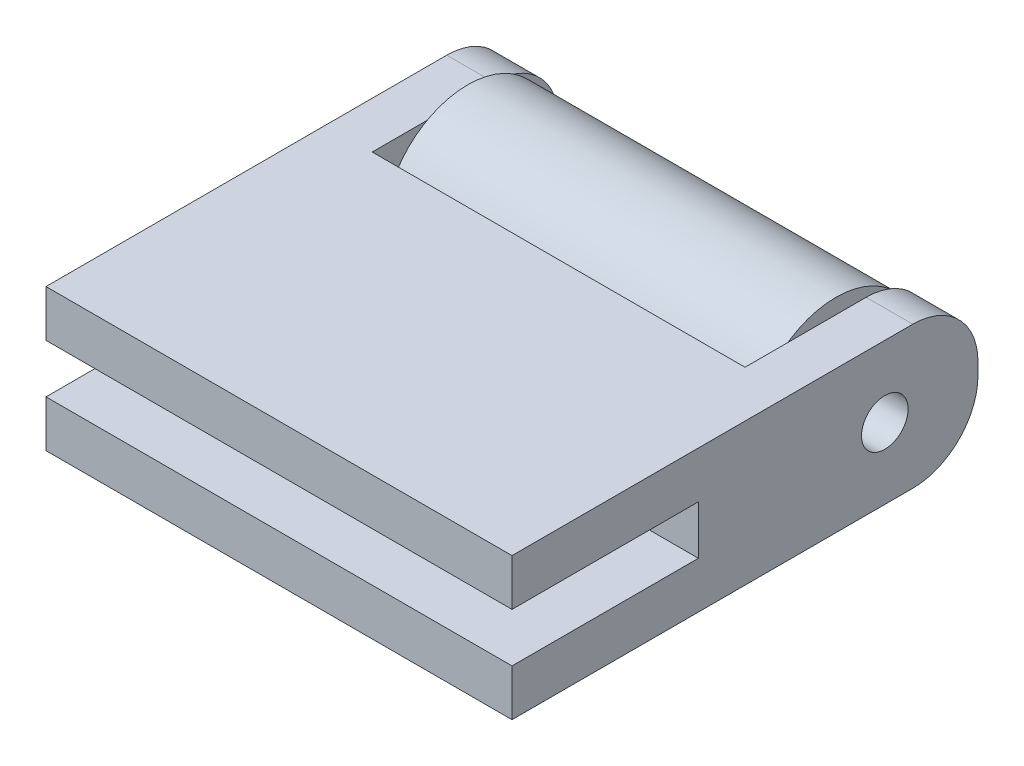
ISO-10303-21;
HEADER;
FILE_DESCRIPTION(('STEP AP214'),'2;1');
FILE_NAME('part.step','',(''),(''),'','','');
FILE_SCHEMA(('AUTOMOTIVE_DESIGN { 1 0 10303 214 1 1 1 1 }'));
ENDSEC;
DATA;
#1=APPLICATION_CONTEXT('core data for automotive mechanical design processes');
#2=APPLICATION_PROTOCOL_DEFINITION('international standard','automotive_design',2000,#1);
#3=PRODUCT_CONTEXT('',#1,'mechanical');
#4=PRODUCT('Part','Part','',(#3));
#5=PRODUCT_RELATED_PRODUCT_CATEGORY('part','',(#4));
#6=PRODUCT_DEFINITION_FORMATION('','',#4);
#7=PRODUCT_DEFINITION_CONTEXT('part definition',#1,'design');
#8=PRODUCT_DEFINITION('design','',#6,#7);
#9=PRODUCT_DEFINITION_SHAPE('','',#8);
#10=(LENGTH_UNIT() NAMED_UNIT(*) SI_UNIT(.MILLI.,.METRE.));
#11=(NAMED_UNIT(*) PLANE_ANGLE_UNIT() SI_UNIT($,.RADIAN.));
#12=(NAMED_UNIT(*) SI_UNIT($,.STERADIAN.) SOLID_ANGLE_UNIT());
#13=UNCERTAINTY_MEASURE_WITH_UNIT(LENGTH_MEASURE(1.E-05),#10,'distance_accuracy_value','');
#14=(GEOMETRIC_REPRESENTATION_CONTEXT(3) GLOBAL_UNCERTAINTY_ASSIGNED_CONTEXT((#13)) GLOBAL_UNIT_ASSIGNED_CONTEXT((#10,
#11,#12)) REPRESENTATION_CONTEXT('',''));
#15=CARTESIAN_POINT('',(0.,0.,0.));
#16=DIRECTION('',(0.,0.,1.));
#17=DIRECTION('',(1.,0.,0.));
#18=AXIS2_PLACEMENT_3D('',#15,#16,#17);
#19=CARTESIAN_POINT('',(44.75,7.625,-40.));
#20=DIRECTION('',(-1.,0.,0.));
#21=DIRECTION('',(0.,0.,1.));
#22=AXIS2_PLACEMENT_3D('',#19,#20,#21);
#23=CYLINDRICAL_SURFACE('',#22,9.);
#24=CARTESIAN_POINT('',(44.75,7.625,-40.));
#25=DIRECTION('',(1.,0.,0.));
#26=DIRECTION('',(0.,0.,-1.));
#27=AXIS2_PLACEMENT_3D('',#24,#25,#26);
#28=CIRCLE('',#27,9.);
#29=CARTESIAN_POINT('',(44.75,7.625,-49.));
#30=VERTEX_POINT('',#29);
#31=EDGE_CURVE('E11',#30,#30,#28,.T.);
#32=ORIENTED_EDGE('',*,*,#31,.F.);
#33=EDGE_LOOP('',(#32));
#34=FACE_BOUND('',#33,.T.);
#35=CARTESIAN_POINT('',(5.25,7.625,-40.));
#36=DIRECTION('',(1.,0.,0.));
#37=DIRECTION('',(0.,0.,-1.));
#38=AXIS2_PLACEMENT_3D('',#35,#36,#37);
#39=CIRCLE('',#38,9.);
#40=CARTESIAN_POINT('',(5.25,7.625,-49.));
#41=VERTEX_POINT('',#40);
#42=EDGE_CURVE('E59',#41,#41,#39,.T.);
#43=ORIENTED_EDGE('',*,*,#42,.T.);
#44=EDGE_LOOP('',(#43));
#45=FACE_BOUND('',#44,.T.);
#46=ADVANCED_FACE('F56',(#34,#45),#23,.T.);
#47=CARTESIAN_POINT('',(44.75,7.625,-40.));
#48=DIRECTION('',(1.,0.,0.));
#49=DIRECTION('',(0.,0.,-1.));
#50=AXIS2_PLACEMENT_3D('',#47,#48,#49);
#51=PLANE('',#50);
#52=CARTESIAN_POINT('',(44.75,7.625,-40.));
#53=DIRECTION('',(1.,0.,0.));
#54=DIRECTION('',(0.,0.,-1.));
#55=AXIS2_PLACEMENT_3D('',#52,#53,#54);
#56=CIRCLE('',#55,2.375);
#57=CARTESIAN_POINT('',(44.75,7.625,-37.625));
#58=VERTEX_POINT('',#57);
#59=EDGE_CURVE('E66',#58,#58,#56,.T.);
#60=ORIENTED_EDGE('',*,*,#59,.F.);
#61=EDGE_LOOP('',(#60));
#62=FACE_BOUND('',#61,.T.);
#63=ORIENTED_EDGE('',*,*,#31,.T.);
#64=EDGE_LOOP('',(#63));
#65=FACE_BOUND('',#64,.T.);
#66=ADVANCED_FACE('F79',(#62,#65),#51,.T.);
#67=CARTESIAN_POINT('',(5.25,7.625,-40.));
#68=DIRECTION('',(1.,0.,0.));
#69=DIRECTION('',(0.,0.,-1.));
#70=AXIS2_PLACEMENT_3D('',#67,#68,#69);
#71=PLANE('',#70);
#72=CARTESIAN_POINT('',(5.25,7.625,-40.));
#73=DIRECTION('',(-1.,0.,0.));
#74=DIRECTION('',(0.,0.,1.));
#75=AXIS2_PLACEMENT_3D('',#72,#73,#74);
#76=CIRCLE('',#75,2.375);
#77=CARTESIAN_POINT('',(5.25,7.625,-37.625));
#78=VERTEX_POINT('',#77);
#79=EDGE_CURVE('E70',#78,#78,#76,.T.);
#80=ORIENTED_EDGE('',*,*,#79,.F.);
#81=EDGE_LOOP('',(#80));
#82=FACE_BOUND('',#81,.T.);
#83=ORIENTED_EDGE('',*,*,#42,.F.);
#84=EDGE_LOOP('',(#83));
#85=FACE_BOUND('',#84,.T.);
#86=ADVANCED_FACE('F76',(#82,#85),#71,.F.);
#87=CARTESIAN_POINT('',(50.,7.625,-40.));
#88=DIRECTION('',(-1.,0.,0.));
#89=DIRECTION('',(0.,0.,1.));
#90=AXIS2_PLACEMENT_3D('',#87,#88,#89);
#91=CYLINDRICAL_SURFACE('',#90,2.375);
#92=CARTESIAN_POINT('',(44.75,7.625,-37.625));
#93=CARTESIAN_POINT('',(44.3385416666667,7.625,-37.625));
#94=CARTESIAN_POINT('',(43.9270833333333,7.625,-37.625));
#95=CARTESIAN_POINT('',(43.1041666666667,7.625,-37.625));
#96=CARTESIAN_POINT('',(42.6927083333333,7.625,-37.625));
#97=CARTESIAN_POINT('',(41.8697916666667,7.625,-37.625));
#98=CARTESIAN_POINT('',(41.4583333333333,7.625,-37.625));
#99=CARTESIAN_POINT('',(40.6354166666667,7.625,-37.625));
#100=CARTESIAN_POINT('',(40.2239583333333,7.625,-37.625));
#101=CARTESIAN_POINT('',(39.4010416666667,7.625,-37.625));
#102=CARTESIAN_POINT('',(38.9895833333333,7.625,-37.625));
#103=CARTESIAN_POINT('',(38.1666666666667,7.625,-37.625));
#104=CARTESIAN_POINT('',(37.7552083333333,7.625,-37.625));
#105=CARTESIAN_POINT('',(36.9322916666667,7.625,-37.625));
#106=CARTESIAN_POINT('',(36.5208333333333,7.625,-37.625));
#107=CARTESIAN_POINT('',(35.6979166666667,7.625,-37.625));
#108=CARTESIAN_POINT('',(35.2864583333333,7.625,-37.625));
#109=CARTESIAN_POINT('',(34.4635416666667,7.625,-37.625));
#110=CARTESIAN_POINT('',(34.0520833333333,7.625,-37.625));
#111=CARTESIAN_POINT('',(33.2291666666667,7.625,-37.625));
#112=CARTESIAN_POINT('',(32.8177083333333,7.625,-37.625));
#113=CARTESIAN_POINT('',(31.9947916666667,7.625,-37.625));
#114=CARTESIAN_POINT('',(31.5833333333333,7.625,-37.625));
#115=CARTESIAN_POINT('',(30.7604166666667,7.625,-37.625));
#116=CARTESIAN_POINT('',(30.3489583333333,7.625,-37.625));
#117=CARTESIAN_POINT('',(29.5260416666667,7.625,-37.625));
#118=CARTESIAN_POINT('',(29.1145833333333,7.625,-37.625));
#119=CARTESIAN_POINT('',(28.2916666666667,7.625,-37.625));
#120=CARTESIAN_POINT('',(27.8802083333333,7.625,-37.625));
#121=CARTESIAN_POINT('',(27.0572916666667,7.625,-37.625));
#122=CARTESIAN_POINT('',(26.6458333333333,7.625,-37.625));
#123=CARTESIAN_POINT('',(25.8229166666667,7.625,-37.625));
#124=CARTESIAN_POINT('',(25.4114583333333,7.625,-37.625));
#125=CARTESIAN_POINT('',(24.5885416666667,7.625,-37.625));
#126=CARTESIAN_POINT('',(24.1770833333333,7.625,-37.625));
#127=CARTESIAN_POINT('',(23.3541666666667,7.625,-37.625));
#128=CARTESIAN_POINT('',(22.9427083333333,7.625,-37.625));
#129=CARTESIAN_POINT('',(22.1197916666667,7.625,-37.625));
#130=CARTESIAN_POINT('',(21.7083333333333,7.625,-37.625));
#131=CARTESIAN_POINT('',(20.8854166666667,7.625,-37.625));
#132=CARTESIAN_POINT('',(20.4739583333333,7.625,-37.625));
#133=CARTESIAN_POINT('',(19.6510416666667,7.625,-37.625));
#134=CARTESIAN_POINT('',(19.2395833333333,7.625,-37.625));
#135=CARTESIAN_POINT('',(18.4166666666667,7.625,-37.625));
#136=CARTESIAN_POINT('',(18.0052083333333,7.625,-37.625));
#137=CARTESIAN_POINT('',(17.1822916666667,7.625,-37.625));
#138=CARTESIAN_POINT('',(16.7708333333333,7.625,-37.625));
#139=CARTESIAN_POINT('',(15.9479166666667,7.625,-37.625));
#140=CARTESIAN_POINT('',(15.5364583333333,7.625,-37.625));
#141=CARTESIAN_POINT('',(14.7135416666667,7.625,-37.625));
#142=CARTESIAN_POINT('',(14.3020833333333,7.625,-37.625));
#143=CARTESIAN_POINT('',(13.4791666666667,7.625,-37.625));
#144=CARTESIAN_POINT('',(13.0677083333333,7.625,-37.625));
#145=CARTESIAN_POINT('',(12.2447916666667,7.625,-37.625));
#146=CARTESIAN_POINT('',(11.8333333333333,7.625,-37.625));
#147=CARTESIAN_POINT('',(11.0104166666667,7.625,-37.625));
#148=CARTESIAN_POINT('',(10.5989583333333,7.625,-37.625));
#149=CARTESIAN_POINT('',(9.77604166666667,7.625,-37.625));
#150=CARTESIAN_POINT('',(9.36458333333334,7.625,-37.625));
#151=CARTESIAN_POINT('',(8.54166666666667,7.625,-37.625));
#152=CARTESIAN_POINT('',(8.13020833333333,7.625,-37.625));
#153=CARTESIAN_POINT('',(7.30729166666666,7.625,-37.625));
#154=CARTESIAN_POINT('',(6.89583333333333,7.625,-37.625));
#155=CARTESIAN_POINT('',(6.07291666666667,7.625,-37.625));
#156=CARTESIAN_POINT('',(5.66145833333334,7.625,-37.625));
#157=CARTESIAN_POINT('',(5.25,7.625,-37.625));
#158=B_SPLINE_CURVE_WITH_KNOTS('',3,(#92,#93,#94,#95,#96,#97,#98,#99,#100,#101,#102,#103,#104,
#105,#106,#107,#108,#109,#110,#111,#112,#113,#114,#115,#116,#117,#118,#119,#120,#121,#122,#123,
#124,#125,#126,#127,#128,#129,#130,#131,#132,#133,#134,#135,#136,#137,#138,#139,#140,#141,#142,
#143,#144,#145,#146,#147,#148,#149,#150,#151,#152,#153,#154,#155,#156,#157),.UNSPECIFIED.,.F.,
.F.,(4,2,2,2,2,2,2,2,2,2,2,2,2,2,2,2,2,2,2,2,2,2,2,2,2,2,2,2,2,2,2,2,4),(0.,1.234375,
2.46875000000001,3.703125,4.9375,6.171875,7.40625,8.64062500000001,9.875,11.109375,12.34375,
13.578125,14.8125,16.046875,17.28125,18.515625,19.75,20.984375,22.21875,23.453125,24.6875,
25.921875,27.15625,28.390625,29.625,30.859375,32.09375,33.328125,34.5625,35.796875,37.03125,
38.265625,39.5),.UNSPECIFIED.);
#159=EDGE_CURVE('BSEAM74',#58,#78,#158,.T.);
#160=ORIENTED_EDGE('',*,*,#59,.T.);
#161=ORIENTED_EDGE('',*,*,#79,.T.);
#162=ORIENTED_EDGE('',*,*,#159,.T.);
#163=ORIENTED_EDGE('',*,*,#159,.F.);
#164=EDGE_LOOP('',(#160,#162,#161,#163));
#165=FACE_BOUND('',#164,.T.);
#166=ADVANCED_FACE('F74',(#165),#91,.F.);
#167=CLOSED_SHELL('',(#46,#66,#86,#166));
#168=MANIFOLD_SOLID_BREP('B2',#167);
#169=CARTESIAN_POINT('',(50.,0.,-50.));
#170=DIRECTION('',(0.,0.,1.));
#171=DIRECTION('',(1.,0.,0.));
#172=AXIS2_PLACEMENT_3D('',#169,#170,#171);
#173=PLANE('',#172);
#174=DIRECTION('',(0.,1.,0.));
#175=VECTOR('',#174,1.);
#176=CARTESIAN_POINT('',(5.,0.,-50.));
#177=LINE('',#176,#175);
#178=CARTESIAN_POINT('',(5.,7.,-50.));
#179=VERTEX_POINT('',#178);
#180=CARTESIAN_POINT('',(5.,8.25,-50.));
#181=VERTEX_POINT('',#180);
#182=EDGE_CURVE('E271',#179,#181,#177,.T.);
#183=ORIENTED_EDGE('',*,*,#182,.F.);
#184=DIRECTION('',(-1.,0.,0.));
#185=VECTOR('',#184,1.);
#186=CARTESIAN_POINT('',(50.,7.,-50.));
#187=LINE('',#186,#185);
#188=CARTESIAN_POINT('',(0.,7.,-50.));
#189=VERTEX_POINT('',#188);
#190=EDGE_CURVE('E398',#179,#189,#187,.T.);
#191=ORIENTED_EDGE('',*,*,#190,.T.);
#192=DIRECTION('',(0.,1.,0.));
#193=VECTOR('',#192,1.);
#194=CARTESIAN_POINT('',(0.,0.,-50.));
#195=LINE('',#194,#193);
#196=CARTESIAN_POINT('',(0.,8.25,-50.));
#197=VERTEX_POINT('',#196);
#198=EDGE_CURVE('E338',#189,#197,#195,.T.);
#199=ORIENTED_EDGE('',*,*,#198,.T.);
#200=DIRECTION('',(-1.,0.,0.));
#201=VECTOR('',#200,1.);
#202=CARTESIAN_POINT('',(5.,8.25,-50.));
#203=LINE('',#202,#201);
#204=EDGE_CURVE('E395',#197,#181,#203,.F.);
#205=ORIENTED_EDGE('',*,*,#204,.T.);
#206=EDGE_LOOP('',(#183,#191,#199,#205));
#207=FACE_BOUND('',#206,.T.);
#208=ADVANCED_FACE('F117',(#207),#173,.F.);
#209=CARTESIAN_POINT('',(50.,7.625,-40.));
#210=DIRECTION('',(-1.,0.,0.));
#211=DIRECTION('',(0.,0.,1.));
#212=AXIS2_PLACEMENT_3D('',#209,#210,#211);
#213=CYLINDRICAL_SURFACE('',#212,2.5);
#214=CARTESIAN_POINT('',(5.,7.625,-40.));
#215=DIRECTION('',(-1.,0.,0.));
#216=DIRECTION('',(0.,0.,1.));
#217=AXIS2_PLACEMENT_3D('',#214,#215,#216);
#218=CIRCLE('',#217,2.5);
#219=CARTESIAN_POINT('',(5.,7.625,-37.5));
#220=VERTEX_POINT('',#219);
#221=EDGE_CURVE('E319',#220,#220,#218,.T.);
#222=ORIENTED_EDGE('',*,*,#221,.F.);
#223=EDGE_LOOP('',(#222));
#224=FACE_BOUND('',#223,.T.);
#225=CARTESIAN_POINT('',(0.,7.625,-40.));
#226=DIRECTION('',(1.,0.,0.));
#227=DIRECTION('',(0.,0.,-1.));
#228=AXIS2_PLACEMENT_3D('',#225,#226,#227);
#229=CIRCLE('',#228,2.5);
#230=CARTESIAN_POINT('',(0.,7.625,-42.5));
#231=VERTEX_POINT('',#230);
#232=EDGE_CURVE('E314',#231,#231,#229,.T.);
#233=ORIENTED_EDGE('',*,*,#232,.F.);
#234=EDGE_LOOP('',(#233));
#235=FACE_BOUND('',#234,.T.);
#236=ADVANCED_FACE('F475',(#224,#235),#213,.F.);
#237=CARTESIAN_POINT('',(50.,10.25,0.));
#238=DIRECTION('',(0.,1.,0.));
#239=DIRECTION('',(0.,0.,1.));
#240=AXIS2_PLACEMENT_3D('',#237,#238,#239);
#241=PLANE('',#240);
#242=DIRECTION('',(0.,0.,-1.));
#243=VECTOR('',#242,1.);
#244=CARTESIAN_POINT('',(0.,10.25,0.));
#245=LINE('',#244,#243);
#246=CARTESIAN_POINT('',(0.,10.25,0.));
#247=VERTEX_POINT('',#246);
#248=CARTESIAN_POINT('',(0.,10.25,-20.));
#249=VERTEX_POINT('',#248);
#250=EDGE_CURVE('E318',#247,#249,#245,.T.);
#251=ORIENTED_EDGE('',*,*,#250,.T.);
#252=DIRECTION('',(-1.,0.,0.));
#253=VECTOR('',#252,1.);
#254=CARTESIAN_POINT('',(50.,10.25,-20.));
#255=LINE('',#254,#253);
#256=CARTESIAN_POINT('',(50.,10.25,-20.));
#257=VERTEX_POINT('',#256);
#258=EDGE_CURVE('E361',#257,#249,#255,.T.);
#259=ORIENTED_EDGE('',*,*,#258,.F.);
#260=DIRECTION('',(0.,0.,-1.));
#261=VECTOR('',#260,1.);
#262=CARTESIAN_POINT('',(50.,10.25,0.));
#263=LINE('',#262,#261);
#264=CARTESIAN_POINT('',(50.,10.25,0.));
#265=VERTEX_POINT('',#264);
#266=EDGE_CURVE('E285',#265,#257,#263,.T.);
#267=ORIENTED_EDGE('',*,*,#266,.F.);
#268=DIRECTION('',(-1.,0.,0.));
#269=VECTOR('',#268,1.);
#270=CARTESIAN_POINT('',(50.,10.25,0.));
#271=LINE('',#270,#269);
#272=EDGE_CURVE('E346',#265,#247,#271,.T.);
#273=ORIENTED_EDGE('',*,*,#272,.T.);
#274=EDGE_LOOP('',(#251,#259,#267,#273));
#275=FACE_BOUND('',#274,.T.);
#276=ADVANCED_FACE('F448',(#275),#241,.F.);
#277=CARTESIAN_POINT('',(50.,0.,-20.));
#278=DIRECTION('',(0.,0.,-1.));
#279=DIRECTION('',(-1.,0.,0.));
#280=AXIS2_PLACEMENT_3D('',#277,#278,#279);
#281=PLANE('',#280);
#282=DIRECTION('',(0.,-1.,0.));
#283=VECTOR('',#282,1.);
#284=CARTESIAN_POINT('',(0.,0.,-20.));
#285=LINE('',#284,#283);
#286=CARTESIAN_POINT('',(0.,5.,-20.));
#287=VERTEX_POINT('',#286);
#288=EDGE_CURVE('E323',#249,#287,#285,.T.);
#289=ORIENTED_EDGE('',*,*,#288,.T.);
#290=DIRECTION('',(-1.,0.,0.));
#291=VECTOR('',#290,1.);
#292=CARTESIAN_POINT('',(50.,5.,-20.));
#293=LINE('',#292,#291);
#294=CARTESIAN_POINT('',(50.,5.,-20.));
#295=VERTEX_POINT('',#294);
#296=EDGE_CURVE('E358',#295,#287,#293,.T.);
#297=ORIENTED_EDGE('',*,*,#296,.F.);
#298=DIRECTION('',(0.,-1.,0.));
#299=VECTOR('',#298,1.);
#300=CARTESIAN_POINT('',(50.,0.,-20.));
#301=LINE('',#300,#299);
#302=EDGE_CURVE('E290',#257,#295,#301,.T.);
#303=ORIENTED_EDGE('',*,*,#302,.F.);
#304=ORIENTED_EDGE('',*,*,#258,.T.);
#305=EDGE_LOOP('',(#289,#297,#303,#304));
#306=FACE_BOUND('',#305,.T.);
#307=ADVANCED_FACE('F453',(#306),#281,.F.);
#308=CARTESIAN_POINT('',(50.,5.,0.));
#309=DIRECTION('',(0.,1.,0.));
#310=DIRECTION('',(0.,0.,1.));
#311=AXIS2_PLACEMENT_3D('',#308,#309,#310);
#312=PLANE('',#311);
#313=DIRECTION('',(0.,0.,-1.));
#314=VECTOR('',#313,1.);
#315=CARTESIAN_POINT('',(0.,5.,0.));
#316=LINE('',#315,#314);
#317=CARTESIAN_POINT('',(0.,5.,0.));
#318=VERTEX_POINT('',#317);
#319=EDGE_CURVE('E327',#318,#287,#316,.T.);
#320=ORIENTED_EDGE('',*,*,#319,.F.);
#321=DIRECTION('',(-1.,0.,0.));
#322=VECTOR('',#321,1.);
#323=CARTESIAN_POINT('',(50.,5.,0.));
#324=LINE('',#323,#322);
#325=CARTESIAN_POINT('',(50.,5.,0.));
#326=VERTEX_POINT('',#325);
#327=EDGE_CURVE('E355',#326,#318,#324,.T.);
#328=ORIENTED_EDGE('',*,*,#327,.F.);
#329=DIRECTION('',(0.,0.,-1.));
#330=VECTOR('',#329,1.);
#331=CARTESIAN_POINT('',(50.,5.,0.));
#332=LINE('',#331,#330);
#333=EDGE_CURVE('E293',#326,#295,#332,.T.);
#334=ORIENTED_EDGE('',*,*,#333,.T.);
#335=ORIENTED_EDGE('',*,*,#296,.T.);
#336=EDGE_LOOP('',(#320,#328,#334,#335));
#337=FACE_BOUND('',#336,.T.);
#338=ADVANCED_FACE('F456',(#337),#312,.T.);
#339=CARTESIAN_POINT('',(50.,0.,0.));
#340=DIRECTION('',(0.,0.,1.));
#341=DIRECTION('',(1.,0.,0.));
#342=AXIS2_PLACEMENT_3D('',#339,#340,#341);
#343=PLANE('',#342);
#344=DIRECTION('',(0.,1.,0.));
#345=VECTOR('',#344,1.);
#346=CARTESIAN_POINT('',(0.,0.,0.));
#347=LINE('',#346,#345);
#348=CARTESIAN_POINT('',(0.,0.,0.));
#349=VERTEX_POINT('',#348);
#350=EDGE_CURVE('E331',#349,#318,#347,.T.);
#351=ORIENTED_EDGE('',*,*,#350,.F.);
#352=DIRECTION('',(-1.,0.,0.));
#353=VECTOR('',#352,1.);
#354=CARTESIAN_POINT('',(50.,0.,0.));
#355=LINE('',#354,#353);
#356=CARTESIAN_POINT('',(50.,0.,0.));
#357=VERTEX_POINT('',#356);
#358=EDGE_CURVE('E352',#357,#349,#355,.T.);
#359=ORIENTED_EDGE('',*,*,#358,.F.);
#360=DIRECTION('',(0.,1.,0.));
#361=VECTOR('',#360,1.);
#362=CARTESIAN_POINT('',(50.,0.,0.));
#363=LINE('',#362,#361);
#364=EDGE_CURVE('E297',#357,#326,#363,.T.);
#365=ORIENTED_EDGE('',*,*,#364,.T.);
#366=ORIENTED_EDGE('',*,*,#327,.T.);
#367=EDGE_LOOP('',(#351,#359,#365,#366));
#368=FACE_BOUND('',#367,.T.);
#369=ADVANCED_FACE('F459',(#368),#343,.T.);
#370=CARTESIAN_POINT('',(50.,0.,0.));
#371=DIRECTION('',(0.,1.,0.));
#372=DIRECTION('',(0.,0.,1.));
#373=AXIS2_PLACEMENT_3D('',#370,#371,#372);
#374=PLANE('',#373);
#375=DIRECTION('',(0.,0.,-1.));
#376=VECTOR('',#375,1.);
#377=CARTESIAN_POINT('',(45.,0.,-50.));
#378=LINE('',#377,#376);
#379=CARTESIAN_POINT('',(45.,0.,-30.));
#380=VERTEX_POINT('',#379);
#381=CARTESIAN_POINT('',(45.,0.,-43.));
#382=VERTEX_POINT('',#381);
#383=EDGE_CURVE('E254',#380,#382,#378,.T.);
#384=ORIENTED_EDGE('',*,*,#383,.T.);
#385=DIRECTION('',(-1.,0.,0.));
#386=VECTOR('',#385,1.);
#387=CARTESIAN_POINT('',(50.,0.,-43.));
#388=LINE('',#387,#386);
#389=CARTESIAN_POINT('',(50.,0.,-43.));
#390=VERTEX_POINT('',#389);
#391=EDGE_CURVE('E386',#382,#390,#388,.F.);
#392=ORIENTED_EDGE('',*,*,#391,.T.);
#393=DIRECTION('',(0.,0.,-1.));
#394=VECTOR('',#393,1.);
#395=CARTESIAN_POINT('',(50.,0.,0.));
#396=LINE('',#395,#394);
#397=EDGE_CURVE('E301',#357,#390,#396,.T.);
#398=ORIENTED_EDGE('',*,*,#397,.F.);
#399=ORIENTED_EDGE('',*,*,#358,.T.);
#400=DIRECTION('',(0.,0.,-1.));
#401=VECTOR('',#400,1.);
#402=CARTESIAN_POINT('',(0.,0.,0.));
#403=LINE('',#402,#401);
#404=CARTESIAN_POINT('',(0.,0.,-43.));
#405=VERTEX_POINT('',#404);
#406=EDGE_CURVE('E335',#349,#405,#403,.T.);
#407=ORIENTED_EDGE('',*,*,#406,.T.);
#408=DIRECTION('',(-1.,0.,0.));
#409=VECTOR('',#408,1.);
#410=CARTESIAN_POINT('',(50.,0.,-43.));
#411=LINE('',#410,#409);
#412=CARTESIAN_POINT('',(5.,0.,-43.));
#413=VERTEX_POINT('',#412);
#414=EDGE_CURVE('E240',#405,#413,#411,.F.);
#415=ORIENTED_EDGE('',*,*,#414,.T.);
#416=DIRECTION('',(0.,0.,1.));
#417=VECTOR('',#416,1.);
#418=CARTESIAN_POINT('',(5.,0.,-50.));
#419=LINE('',#418,#417);
#420=CARTESIAN_POINT('',(5.,0.,-30.));
#421=VERTEX_POINT('',#420);
#422=EDGE_CURVE('E232',#413,#421,#419,.T.);
#423=ORIENTED_EDGE('',*,*,#422,.T.);
#424=DIRECTION('',(1.,0.,0.));
#425=VECTOR('',#424,1.);
#426=CARTESIAN_POINT('',(5.,0.,-30.));
#427=LINE('',#426,#425);
#428=EDGE_CURVE('E237',#421,#380,#427,.T.);
#429=ORIENTED_EDGE('',*,*,#428,.T.);
#430=EDGE_LOOP('',(#384,#392,#398,#399,#407,#415,#423,#429));
#431=FACE_BOUND('',#430,.T.);
#432=ADVANCED_FACE('F235',(#431),#374,.F.);
#433=DIRECTION('',(0.,1.,0.));
#434=VECTOR('',#433,1.);
#435=CARTESIAN_POINT('',(50.,0.,-50.));
#436=LINE('',#435,#434);
#437=CARTESIAN_POINT('',(50.,7.,-50.));
#438=VERTEX_POINT('',#437);
#439=CARTESIAN_POINT('',(50.,8.25,-50.));
#440=VERTEX_POINT('',#439);
#441=EDGE_CURVE('E306',#438,#440,#436,.T.);
#442=ORIENTED_EDGE('',*,*,#441,.F.);
#443=DIRECTION('',(-1.,0.,0.));
#444=VECTOR('',#443,1.);
#445=CARTESIAN_POINT('',(50.,7.,-50.));
#446=LINE('',#445,#444);
#447=CARTESIAN_POINT('',(45.,7.,-50.));
#448=VERTEX_POINT('',#447);
#449=EDGE_CURVE('E374',#438,#448,#446,.T.);
#450=ORIENTED_EDGE('',*,*,#449,.T.);
#451=DIRECTION('',(0.,1.,0.));
#452=VECTOR('',#451,1.);
#453=CARTESIAN_POINT('',(45.,0.,-50.));
#454=LINE('',#453,#452);
#455=CARTESIAN_POINT('',(45.,8.25,-50.));
#456=VERTEX_POINT('',#455);
#457=EDGE_CURVE('E275',#448,#456,#454,.T.);
#458=ORIENTED_EDGE('',*,*,#457,.T.);
#459=DIRECTION('',(-1.,0.,0.));
#460=VECTOR('',#459,1.);
#461=CARTESIAN_POINT('',(50.,8.25,-50.));
#462=LINE('',#461,#460);
#463=EDGE_CURVE('E365',#456,#440,#462,.F.);
#464=ORIENTED_EDGE('',*,*,#463,.T.);
#465=EDGE_LOOP('',(#442,#450,#458,#464));
#466=FACE_BOUND('',#465,.T.);
#467=ADVANCED_FACE('F468',(#466),#173,.F.);
#468=CARTESIAN_POINT('',(50.,15.25,0.));
#469=DIRECTION('',(0.,1.,0.));
#470=DIRECTION('',(0.,0.,1.));
#471=AXIS2_PLACEMENT_3D('',#468,#469,#470);
#472=PLANE('',#471);
#473=DIRECTION('',(0.,0.,1.));
#474=VECTOR('',#473,1.);
#475=CARTESIAN_POINT('',(5.,15.25,-50.));
#476=LINE('',#475,#474);
#477=CARTESIAN_POINT('',(5.,15.25,-43.));
#478=VERTEX_POINT('',#477);
#479=CARTESIAN_POINT('',(5.,15.25,-30.));
#480=VERTEX_POINT('',#479);
#481=EDGE_CURVE('E248',#478,#480,#476,.T.);
#482=ORIENTED_EDGE('',*,*,#481,.F.);
#483=DIRECTION('',(-1.,0.,0.));
#484=VECTOR('',#483,1.);
#485=CARTESIAN_POINT('',(0.,15.25,-43.));
#486=LINE('',#485,#484);
#487=CARTESIAN_POINT('',(0.,15.25,-43.));
#488=VERTEX_POINT('',#487);
#489=EDGE_CURVE('E54',#478,#488,#486,.T.);
#490=ORIENTED_EDGE('',*,*,#489,.T.);
#491=DIRECTION('',(0.,0.,-1.));
#492=VECTOR('',#491,1.);
#493=CARTESIAN_POINT('',(0.,15.25,0.));
#494=LINE('',#493,#492);
#495=CARTESIAN_POINT('',(0.,15.25,0.));
#496=VERTEX_POINT('',#495);
#497=EDGE_CURVE('E342',#496,#488,#494,.T.);
#498=ORIENTED_EDGE('',*,*,#497,.F.);
#499=DIRECTION('',(-1.,0.,0.));
#500=VECTOR('',#499,1.);
#501=CARTESIAN_POINT('',(50.,15.25,0.));
#502=LINE('',#501,#500);
#503=CARTESIAN_POINT('',(50.,15.25,0.));
#504=VERTEX_POINT('',#503);
#505=EDGE_CURVE('E349',#504,#496,#502,.T.);
#506=ORIENTED_EDGE('',*,*,#505,.F.);
#507=DIRECTION('',(0.,0.,-1.));
#508=VECTOR('',#507,1.);
#509=CARTESIAN_POINT('',(50.,15.25,0.));
#510=LINE('',#509,#508);
#511=CARTESIAN_POINT('',(50.,15.25,-43.));
#512=VERTEX_POINT('',#511);
#513=EDGE_CURVE('E310',#504,#512,#510,.T.);
#514=ORIENTED_EDGE('',*,*,#513,.T.);
#515=DIRECTION('',(-1.,0.,0.));
#516=VECTOR('',#515,1.);
#517=CARTESIAN_POINT('',(45.,15.25,-43.));
#518=LINE('',#517,#516);
#519=CARTESIAN_POINT('',(45.,15.25,-43.));
#520=VERTEX_POINT('',#519);
#521=EDGE_CURVE('E126',#512,#520,#518,.T.);
#522=ORIENTED_EDGE('',*,*,#521,.T.);
#523=DIRECTION('',(0.,0.,-1.));
#524=VECTOR('',#523,1.);
#525=CARTESIAN_POINT('',(45.,15.25,-50.));
#526=LINE('',#525,#524);
#527=CARTESIAN_POINT('',(45.,15.25,-30.));
#528=VERTEX_POINT('',#527);
#529=EDGE_CURVE('E243',#528,#520,#526,.T.);
#530=ORIENTED_EDGE('',*,*,#529,.F.);
#531=DIRECTION('',(1.,0.,0.));
#532=VECTOR('',#531,1.);
#533=CARTESIAN_POINT('',(5.,15.25,-30.));
#534=LINE('',#533,#532);
#535=EDGE_CURVE('E265',#480,#528,#534,.T.);
#536=ORIENTED_EDGE('',*,*,#535,.F.);
#537=EDGE_LOOP('',(#482,#490,#498,#506,#514,#522,#530,#536));
#538=FACE_BOUND('',#537,.T.);
#539=ADVANCED_FACE('F416',(#538),#472,.T.);
#540=CARTESIAN_POINT('',(45.,7.625,-40.));
#541=DIRECTION('',(1.,0.,0.));
#542=DIRECTION('',(0.,0.,-1.));
#543=AXIS2_PLACEMENT_3D('',#540,#541,#542);
#544=CIRCLE('',#543,2.5);
#545=CARTESIAN_POINT('',(45.,7.625,-42.5));
#546=VERTEX_POINT('',#545);
#547=EDGE_CURVE('E274',#546,#546,#544,.T.);
#548=ORIENTED_EDGE('',*,*,#547,.F.);
#549=EDGE_LOOP('',(#548));
#550=FACE_BOUND('',#549,.T.);
#551=CARTESIAN_POINT('',(50.,7.625,-40.));
#552=DIRECTION('',(1.,0.,0.));
#553=DIRECTION('',(0.,0.,-1.));
#554=AXIS2_PLACEMENT_3D('',#551,#552,#553);
#555=CIRCLE('',#554,2.5);
#556=CARTESIAN_POINT('',(50.,7.625,-42.5));
#557=VERTEX_POINT('',#556);
#558=EDGE_CURVE('E281',#557,#557,#555,.T.);
#559=ORIENTED_EDGE('',*,*,#558,.T.);
#560=EDGE_LOOP('',(#559));
#561=FACE_BOUND('',#560,.T.);
#562=ADVANCED_FACE('F484',(#550,#561),#213,.F.);
#563=EDGE_CURVE('E286',#247,#496,#347,.T.);
#564=ORIENTED_EDGE('',*,*,#563,.F.);
#565=ORIENTED_EDGE('',*,*,#272,.F.);
#566=EDGE_CURVE('E302',#265,#504,#363,.T.);
#567=ORIENTED_EDGE('',*,*,#566,.T.);
#568=ORIENTED_EDGE('',*,*,#505,.T.);
#569=EDGE_LOOP('',(#564,#565,#567,#568));
#570=FACE_BOUND('',#569,.T.);
#571=ADVANCED_FACE('F442',(#570),#343,.T.);
#572=CARTESIAN_POINT('',(50.,0.,0.));
#573=DIRECTION('',(1.,0.,0.));
#574=DIRECTION('',(0.,0.,-1.));
#575=AXIS2_PLACEMENT_3D('',#572,#573,#574);
#576=PLANE('',#575);
#577=ORIENTED_EDGE('',*,*,#558,.F.);
#578=EDGE_LOOP('',(#577));
#579=FACE_BOUND('',#578,.T.);
#580=ORIENTED_EDGE('',*,*,#397,.T.);
#581=CARTESIAN_POINT('',(50.,7.,-43.));
#582=DIRECTION('',(1.,0.,0.));
#583=DIRECTION('',(0.,0.,-1.));
#584=AXIS2_PLACEMENT_3D('',#581,#582,#583);
#585=CIRCLE('',#584,7.);
#586=EDGE_CURVE('E392',#390,#438,#585,.T.);
#587=ORIENTED_EDGE('',*,*,#586,.T.);
#588=ORIENTED_EDGE('',*,*,#441,.T.);
#589=CARTESIAN_POINT('',(50.,8.25,-43.));
#590=DIRECTION('',(1.,0.,0.));
#591=DIRECTION('',(0.,0.,-1.));
#592=AXIS2_PLACEMENT_3D('',#589,#590,#591);
#593=CIRCLE('',#592,7.);
#594=EDGE_CURVE('E389',#440,#512,#593,.T.);
#595=ORIENTED_EDGE('',*,*,#594,.T.);
#596=ORIENTED_EDGE('',*,*,#513,.F.);
#597=ORIENTED_EDGE('',*,*,#566,.F.);
#598=ORIENTED_EDGE('',*,*,#266,.T.);
#599=ORIENTED_EDGE('',*,*,#302,.T.);
#600=ORIENTED_EDGE('',*,*,#333,.F.);
#601=ORIENTED_EDGE('',*,*,#364,.F.);
#602=EDGE_LOOP('',(#580,#587,#588,#595,#596,#597,#598,#599,#600,#601));
#603=FACE_BOUND('',#602,.T.);
#604=ADVANCED_FACE('F441',(#579,#603),#576,.T.);
#605=CARTESIAN_POINT('',(0.,0.,0.));
#606=DIRECTION('',(1.,0.,0.));
#607=DIRECTION('',(0.,0.,-1.));
#608=AXIS2_PLACEMENT_3D('',#605,#606,#607);
#609=PLANE('',#608);
#610=ORIENTED_EDGE('',*,*,#232,.T.);
#611=EDGE_LOOP('',(#610));
#612=FACE_BOUND('',#611,.T.);
#613=ORIENTED_EDGE('',*,*,#198,.F.);
#614=CARTESIAN_POINT('',(0.,7.,-43.));
#615=DIRECTION('',(1.,0.,0.));
#616=DIRECTION('',(0.,0.,-1.));
#617=AXIS2_PLACEMENT_3D('',#614,#615,#616);
#618=CIRCLE('',#617,7.);
#619=EDGE_CURVE('E404',#189,#405,#618,.F.);
#620=ORIENTED_EDGE('',*,*,#619,.T.);
#621=ORIENTED_EDGE('',*,*,#406,.F.);
#622=ORIENTED_EDGE('',*,*,#350,.T.);
#623=ORIENTED_EDGE('',*,*,#319,.T.);
#624=ORIENTED_EDGE('',*,*,#288,.F.);
#625=ORIENTED_EDGE('',*,*,#250,.F.);
#626=ORIENTED_EDGE('',*,*,#563,.T.);
#627=ORIENTED_EDGE('',*,*,#497,.T.);
#628=CARTESIAN_POINT('',(0.,8.25,-43.));
#629=DIRECTION('',(1.,0.,0.));
#630=DIRECTION('',(0.,0.,-1.));
#631=AXIS2_PLACEMENT_3D('',#628,#629,#630);
#632=CIRCLE('',#631,7.);
#633=EDGE_CURVE('E141',#488,#197,#632,.F.);
#634=ORIENTED_EDGE('',*,*,#633,.T.);
#635=EDGE_LOOP('',(#613,#620,#621,#622,#623,#624,#625,#626,#627,#634));
#636=FACE_BOUND('',#635,.T.);
#637=ADVANCED_FACE('F432',(#612,#636),#609,.F.);
#638=CARTESIAN_POINT('',(5.,0.,-50.));
#639=DIRECTION('',(-1.,0.,0.));
#640=DIRECTION('',(0.,0.,1.));
#641=AXIS2_PLACEMENT_3D('',#638,#639,#640);
#642=PLANE('',#641);
#643=ORIENTED_EDGE('',*,*,#221,.T.);
#644=EDGE_LOOP('',(#643));
#645=FACE_BOUND('',#644,.T.);
#646=ORIENTED_EDGE('',*,*,#422,.F.);
#647=CARTESIAN_POINT('',(5.,7.,-43.));
#648=DIRECTION('',(-1.,0.,0.));
#649=DIRECTION('',(0.,0.,1.));
#650=AXIS2_PLACEMENT_3D('',#647,#648,#649);
#651=CIRCLE('',#650,7.);
#652=EDGE_CURVE('E409',#413,#179,#651,.F.);
#653=ORIENTED_EDGE('',*,*,#652,.T.);
#654=ORIENTED_EDGE('',*,*,#182,.T.);
#655=CARTESIAN_POINT('',(5.,8.25,-43.));
#656=DIRECTION('',(-1.,0.,0.));
#657=DIRECTION('',(0.,0.,1.));
#658=AXIS2_PLACEMENT_3D('',#655,#656,#657);
#659=CIRCLE('',#658,7.);
#660=EDGE_CURVE('E133',#181,#478,#659,.F.);
#661=ORIENTED_EDGE('',*,*,#660,.T.);
#662=ORIENTED_EDGE('',*,*,#481,.T.);
#663=DIRECTION('',(0.,1.,0.));
#664=VECTOR('',#663,1.);
#665=CARTESIAN_POINT('',(5.,0.,-30.));
#666=LINE('',#665,#664);
#667=EDGE_CURVE('E246',#421,#480,#666,.T.);
#668=ORIENTED_EDGE('',*,*,#667,.F.);
#669=EDGE_LOOP('',(#646,#653,#654,#661,#662,#668));
#670=FACE_BOUND('',#669,.T.);
#671=ADVANCED_FACE('F247',(#645,#670),#642,.F.);
#672=CARTESIAN_POINT('',(45.,0.,-50.));
#673=DIRECTION('',(1.,0.,0.));
#674=DIRECTION('',(0.,0.,-1.));
#675=AXIS2_PLACEMENT_3D('',#672,#673,#674);
#676=PLANE('',#675);
#677=ORIENTED_EDGE('',*,*,#547,.T.);
#678=EDGE_LOOP('',(#677));
#679=FACE_BOUND('',#678,.T.);
#680=ORIENTED_EDGE('',*,*,#457,.F.);
#681=CARTESIAN_POINT('',(45.,7.,-43.));
#682=DIRECTION('',(1.,0.,0.));
#683=DIRECTION('',(0.,0.,-1.));
#684=AXIS2_PLACEMENT_3D('',#681,#682,#683);
#685=CIRCLE('',#684,7.);
#686=EDGE_CURVE('E381',#448,#382,#685,.F.);
#687=ORIENTED_EDGE('',*,*,#686,.T.);
#688=ORIENTED_EDGE('',*,*,#383,.F.);
#689=DIRECTION('',(0.,1.,0.));
#690=VECTOR('',#689,1.);
#691=CARTESIAN_POINT('',(45.,0.,-30.));
#692=LINE('',#691,#690);
#693=EDGE_CURVE('E253',#380,#528,#692,.T.);
#694=ORIENTED_EDGE('',*,*,#693,.T.);
#695=ORIENTED_EDGE('',*,*,#529,.T.);
#696=CARTESIAN_POINT('',(45.,8.25,-43.));
#697=DIRECTION('',(1.,0.,0.));
#698=DIRECTION('',(0.,0.,-1.));
#699=AXIS2_PLACEMENT_3D('',#696,#697,#698);
#700=CIRCLE('',#699,7.);
#701=EDGE_CURVE('E378',#520,#456,#700,.F.);
#702=ORIENTED_EDGE('',*,*,#701,.T.);
#703=EDGE_LOOP('',(#680,#687,#688,#694,#695,#702));
#704=FACE_BOUND('',#703,.T.);
#705=ADVANCED_FACE('F422',(#679,#704),#676,.F.);
#706=CARTESIAN_POINT('',(5.,0.,-30.));
#707=DIRECTION('',(0.,0.,1.));
#708=DIRECTION('',(1.,0.,0.));
#709=AXIS2_PLACEMENT_3D('',#706,#707,#708);
#710=PLANE('',#709);
#711=ORIENTED_EDGE('',*,*,#535,.T.);
#712=ORIENTED_EDGE('',*,*,#693,.F.);
#713=ORIENTED_EDGE('',*,*,#428,.F.);
#714=ORIENTED_EDGE('',*,*,#667,.T.);
#715=EDGE_LOOP('',(#711,#712,#713,#714));
#716=FACE_BOUND('',#715,.T.);
#717=ADVANCED_FACE('F256',(#716),#710,.F.);
#718=CARTESIAN_POINT('',(50.,7.,-43.));
#719=DIRECTION('',(-1.,0.,0.));
#720=DIRECTION('',(0.,0.,1.));
#721=AXIS2_PLACEMENT_3D('',#718,#719,#720);
#722=CYLINDRICAL_SURFACE('',#721,7.);
#723=ORIENTED_EDGE('',*,*,#586,.F.);
#724=ORIENTED_EDGE('',*,*,#391,.F.);
#725=ORIENTED_EDGE('',*,*,#686,.F.);
#726=ORIENTED_EDGE('',*,*,#449,.F.);
#727=EDGE_LOOP('',(#723,#724,#725,#726));
#728=FACE_BOUND('',#727,.T.);
#729=ADVANCED_FACE('F466',(#728),#722,.T.);
#730=CARTESIAN_POINT('',(50.,7.,-43.));
#731=DIRECTION('',(-1.,0.,0.));
#732=DIRECTION('',(0.,0.,1.));
#733=AXIS2_PLACEMENT_3D('',#730,#731,#732);
#734=CYLINDRICAL_SURFACE('',#733,7.);
#735=ORIENTED_EDGE('',*,*,#652,.F.);
#736=ORIENTED_EDGE('',*,*,#414,.F.);
#737=ORIENTED_EDGE('',*,*,#619,.F.);
#738=ORIENTED_EDGE('',*,*,#190,.F.);
#739=EDGE_LOOP('',(#735,#736,#737,#738));
#740=FACE_BOUND('',#739,.T.);
#741=ADVANCED_FACE('F430',(#740),#734,.T.);
#742=CARTESIAN_POINT('',(50.,8.25,-43.));
#743=DIRECTION('',(1.,0.,0.));
#744=DIRECTION('',(0.,0.,-1.));
#745=AXIS2_PLACEMENT_3D('',#742,#743,#744);
#746=CYLINDRICAL_SURFACE('',#745,7.);
#747=ORIENTED_EDGE('',*,*,#660,.F.);
#748=ORIENTED_EDGE('',*,*,#204,.F.);
#749=ORIENTED_EDGE('',*,*,#633,.F.);
#750=ORIENTED_EDGE('',*,*,#489,.F.);
#751=EDGE_LOOP('',(#747,#748,#749,#750));
#752=FACE_BOUND('',#751,.T.);
#753=ADVANCED_FACE('F424',(#752),#746,.T.);
#754=CARTESIAN_POINT('',(50.,8.25,-43.));
#755=DIRECTION('',(1.,0.,0.));
#756=DIRECTION('',(0.,0.,-1.));
#757=AXIS2_PLACEMENT_3D('',#754,#755,#756);
#758=CYLINDRICAL_SURFACE('',#757,7.);
#759=ORIENTED_EDGE('',*,*,#594,.F.);
#760=ORIENTED_EDGE('',*,*,#463,.F.);
#761=ORIENTED_EDGE('',*,*,#701,.F.);
#762=ORIENTED_EDGE('',*,*,#521,.F.);
#763=EDGE_LOOP('',(#759,#760,#761,#762));
#764=FACE_BOUND('',#763,.T.);
#765=ADVANCED_FACE('F119',(#764),#758,.T.);
#766=CLOSED_SHELL('',(#208,#236,#276,#307,#338,#369,#432,#467,#539,#562,#571,#604,#637,#671,
#705,#717,#729,#741,#753,#765));
#767=MANIFOLD_SOLID_BREP('B6',#766);
#768=ADVANCED_BREP_SHAPE_REPRESENTATION('',(#18,#168,#767),#14);
#769=SHAPE_DEFINITION_REPRESENTATION(#9,#768);
ENDSEC;
END-ISO-10303-21;
